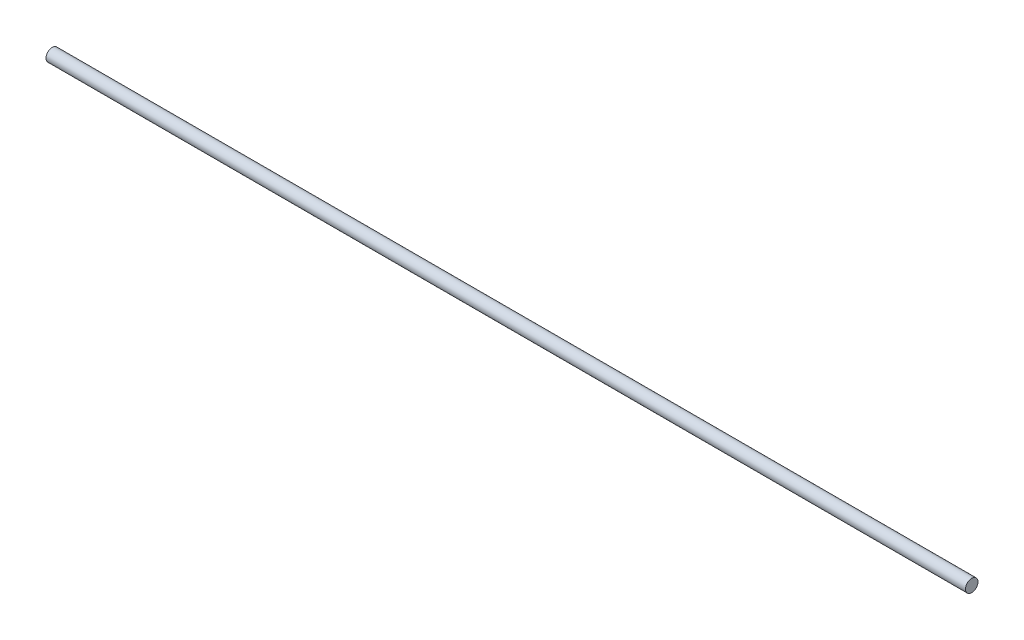
ISO-10303-21;
HEADER;
FILE_DESCRIPTION(('STEP AP214'),'2;1');
FILE_NAME('part.step','',(''),(''),'','','');
FILE_SCHEMA(('AUTOMOTIVE_DESIGN { 1 0 10303 214 1 1 1 1 }'));
ENDSEC;
DATA;
#1=APPLICATION_CONTEXT('core data for automotive mechanical design processes');
#2=APPLICATION_PROTOCOL_DEFINITION('international standard','automotive_design',2000,#1);
#3=PRODUCT_CONTEXT('',#1,'mechanical');
#4=PRODUCT('Part','Part','',(#3));
#5=PRODUCT_RELATED_PRODUCT_CATEGORY('part','',(#4));
#6=PRODUCT_DEFINITION_FORMATION('','',#4);
#7=PRODUCT_DEFINITION_CONTEXT('part definition',#1,'design');
#8=PRODUCT_DEFINITION('design','',#6,#7);
#9=PRODUCT_DEFINITION_SHAPE('','',#8);
#10=(LENGTH_UNIT() NAMED_UNIT(*) SI_UNIT(.MILLI.,.METRE.));
#11=(NAMED_UNIT(*) PLANE_ANGLE_UNIT() SI_UNIT($,.RADIAN.));
#12=(NAMED_UNIT(*) SI_UNIT($,.STERADIAN.) SOLID_ANGLE_UNIT());
#13=UNCERTAINTY_MEASURE_WITH_UNIT(LENGTH_MEASURE(1.E-05),#10,'distance_accuracy_value','');
#14=(GEOMETRIC_REPRESENTATION_CONTEXT(3) GLOBAL_UNCERTAINTY_ASSIGNED_CONTEXT((#13)) GLOBAL_UNIT_ASSIGNED_CONTEXT((#10,
#11,#12)) REPRESENTATION_CONTEXT('',''));
#15=CARTESIAN_POINT('',(0.,0.,0.));
#16=DIRECTION('',(0.,0.,1.));
#17=DIRECTION('',(1.,0.,0.));
#18=AXIS2_PLACEMENT_3D('',#15,#16,#17);
#19=CARTESIAN_POINT('',(146.05,0.,0.));
#20=DIRECTION('',(-1.,0.,0.));
#21=DIRECTION('',(0.,0.,1.));
#22=AXIS2_PLACEMENT_3D('',#19,#20,#21);
#23=CYLINDRICAL_SURFACE('',#22,1.984375);
#24=CARTESIAN_POINT('',(146.05,0.,0.));
#25=DIRECTION('',(1.,0.,0.));
#26=DIRECTION('',(0.,0.,-1.));
#27=AXIS2_PLACEMENT_3D('',#24,#25,#26);
#28=CIRCLE('',#27,1.984375);
#29=CARTESIAN_POINT('',(146.05,0.,-1.984375));
#30=VERTEX_POINT('',#29);
#31=EDGE_CURVE('E10',#30,#30,#28,.T.);
#32=ORIENTED_EDGE('',*,*,#31,.F.);
#33=EDGE_LOOP('',(#32));
#34=FACE_BOUND('',#33,.T.);
#35=CARTESIAN_POINT('',(-146.05,0.,0.));
#36=DIRECTION('',(1.,0.,0.));
#37=DIRECTION('',(0.,0.,-1.));
#38=AXIS2_PLACEMENT_3D('',#35,#36,#37);
#39=CIRCLE('',#38,1.984375);
#40=CARTESIAN_POINT('',(-146.05,0.,-1.984375));
#41=VERTEX_POINT('',#40);
#42=EDGE_CURVE('E40',#41,#41,#39,.T.);
#43=ORIENTED_EDGE('',*,*,#42,.T.);
#44=EDGE_LOOP('',(#43));
#45=FACE_BOUND('',#44,.T.);
#46=ADVANCED_FACE('F37',(#34,#45),#23,.T.);
#47=CARTESIAN_POINT('',(146.05,0.,0.));
#48=DIRECTION('',(1.,0.,0.));
#49=DIRECTION('',(0.,0.,-1.));
#50=AXIS2_PLACEMENT_3D('',#47,#48,#49);
#51=PLANE('',#50);
#52=ORIENTED_EDGE('',*,*,#31,.T.);
#53=EDGE_LOOP('',(#52));
#54=FACE_BOUND('',#53,.T.);
#55=ADVANCED_FACE('F52',(#54),#51,.T.);
#56=CARTESIAN_POINT('',(-146.05,0.,0.));
#57=DIRECTION('',(1.,0.,0.));
#58=DIRECTION('',(0.,0.,-1.));
#59=AXIS2_PLACEMENT_3D('',#56,#57,#58);
#60=PLANE('',#59);
#61=ORIENTED_EDGE('',*,*,#42,.F.);
#62=EDGE_LOOP('',(#61));
#63=FACE_BOUND('',#62,.T.);
#64=ADVANCED_FACE('F50',(#63),#60,.F.);
#65=CLOSED_SHELL('',(#46,#55,#64));
#66=MANIFOLD_SOLID_BREP('B2',#65);
#67=ADVANCED_BREP_SHAPE_REPRESENTATION('',(#18,#66),#14);
#68=SHAPE_DEFINITION_REPRESENTATION(#9,#67);
ENDSEC;
END-ISO-10303-21;
